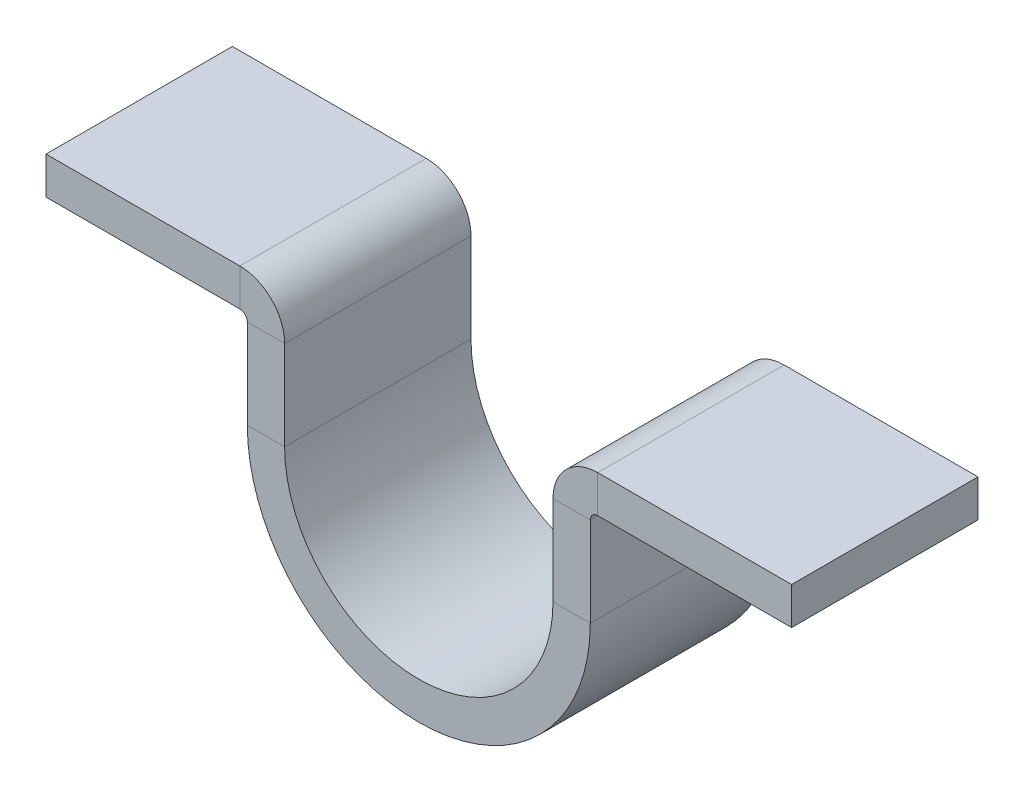
ISO-10303-21;
HEADER;
FILE_DESCRIPTION(('STEP AP214'),'2;1');
FILE_NAME('part.step','',(''),(''),'','','');
FILE_SCHEMA(('AUTOMOTIVE_DESIGN { 1 0 10303 214 1 1 1 1 }'));
ENDSEC;
DATA;
#1=APPLICATION_CONTEXT('core data for automotive mechanical design processes');
#2=APPLICATION_PROTOCOL_DEFINITION('international standard','automotive_design',2000,#1);
#3=PRODUCT_CONTEXT('',#1,'mechanical');
#4=PRODUCT('Part','Part','',(#3));
#5=PRODUCT_RELATED_PRODUCT_CATEGORY('part','',(#4));
#6=PRODUCT_DEFINITION_FORMATION('','',#4);
#7=PRODUCT_DEFINITION_CONTEXT('part definition',#1,'design');
#8=PRODUCT_DEFINITION('design','',#6,#7);
#9=PRODUCT_DEFINITION_SHAPE('','',#8);
#10=(LENGTH_UNIT() NAMED_UNIT(*) SI_UNIT(.MILLI.,.METRE.));
#11=(NAMED_UNIT(*) PLANE_ANGLE_UNIT() SI_UNIT($,.RADIAN.));
#12=(NAMED_UNIT(*) SI_UNIT($,.STERADIAN.) SOLID_ANGLE_UNIT());
#13=UNCERTAINTY_MEASURE_WITH_UNIT(LENGTH_MEASURE(1.E-05),#10,'distance_accuracy_value','');
#14=(GEOMETRIC_REPRESENTATION_CONTEXT(3) GLOBAL_UNCERTAINTY_ASSIGNED_CONTEXT((#13)) GLOBAL_UNIT_ASSIGNED_CONTEXT((#10,
#11,#12)) REPRESENTATION_CONTEXT('',''));
#15=CARTESIAN_POINT('',(0.,0.,0.));
#16=DIRECTION('',(0.,0.,1.));
#17=DIRECTION('',(1.,0.,0.));
#18=AXIS2_PLACEMENT_3D('',#15,#16,#17);
#19=CARTESIAN_POINT('',(18.,-18.,25.));
#20=DIRECTION('',(0.,0.,1.));
#21=DIRECTION('',(1.,0.,0.));
#22=AXIS2_PLACEMENT_3D('',#19,#20,#21);
#23=PLANE('',#22);
#24=DIRECTION('',(1.,0.,0.));
#25=VECTOR('',#24,1.);
#26=CARTESIAN_POINT('',(18.,-18.,25.));
#27=LINE('',#26,#25);
#28=CARTESIAN_POINT('',(18.,-18.,25.));
#29=VERTEX_POINT('',#28);
#30=CARTESIAN_POINT('',(23.,-18.,25.));
#31=VERTEX_POINT('',#30);
#32=EDGE_CURVE('E11',#29,#31,#27,.T.);
#33=ORIENTED_EDGE('',*,*,#32,.F.);
#34=CARTESIAN_POINT('',(0.,-18.,25.));
#35=DIRECTION('',(0.,0.,1.));
#36=DIRECTION('',(1.,0.,0.));
#37=AXIS2_PLACEMENT_3D('',#34,#35,#36);
#38=CIRCLE('',#37,18.);
#39=CARTESIAN_POINT('',(-18.,-18.,25.));
#40=VERTEX_POINT('',#39);
#41=EDGE_CURVE('E304',#40,#29,#38,.T.);
#42=ORIENTED_EDGE('',*,*,#41,.F.);
#43=DIRECTION('',(1.,0.,0.));
#44=VECTOR('',#43,1.);
#45=CARTESIAN_POINT('',(-23.,-18.,25.));
#46=LINE('',#45,#44);
#47=CARTESIAN_POINT('',(-23.,-18.,25.));
#48=VERTEX_POINT('',#47);
#49=EDGE_CURVE('E47',#48,#40,#46,.T.);
#50=ORIENTED_EDGE('',*,*,#49,.F.);
#51=CARTESIAN_POINT('',(0.,-18.,25.));
#52=DIRECTION('',(0.,0.,1.));
#53=DIRECTION('',(1.,0.,0.));
#54=AXIS2_PLACEMENT_3D('',#51,#52,#53);
#55=CIRCLE('',#54,23.);
#56=EDGE_CURVE('E172',#48,#31,#55,.T.);
#57=ORIENTED_EDGE('',*,*,#56,.T.);
#58=EDGE_LOOP('',(#33,#42,#50,#57));
#59=FACE_BOUND('',#58,.T.);
#60=ADVANCED_FACE('F39',(#59),#23,.T.);
#61=CARTESIAN_POINT('',(-23.,-18.,25.));
#62=DIRECTION('',(0.,0.,1.));
#63=DIRECTION('',(1.,0.,0.));
#64=AXIS2_PLACEMENT_3D('',#61,#62,#63);
#65=PLANE('',#64);
#66=DIRECTION('',(0.,1.,0.));
#67=VECTOR('',#66,1.);
#68=CARTESIAN_POINT('',(18.,-18.,25.));
#69=LINE('',#68,#67);
#70=CARTESIAN_POINT('',(18.,-6.,25.));
#71=VERTEX_POINT('',#70);
#72=EDGE_CURVE('E166',#29,#71,#69,.T.);
#73=ORIENTED_EDGE('',*,*,#72,.F.);
#74=ORIENTED_EDGE('',*,*,#32,.T.);
#75=DIRECTION('',(0.,1.,0.));
#76=VECTOR('',#75,1.);
#77=CARTESIAN_POINT('',(23.,-18.,25.));
#78=LINE('',#77,#76);
#79=CARTESIAN_POINT('',(23.,-6.,25.));
#80=VERTEX_POINT('',#79);
#81=EDGE_CURVE('E163',#31,#80,#78,.T.);
#82=ORIENTED_EDGE('',*,*,#81,.T.);
#83=DIRECTION('',(-1.,0.,0.));
#84=VECTOR('',#83,1.);
#85=CARTESIAN_POINT('',(23.,-6.,25.));
#86=LINE('',#85,#84);
#87=EDGE_CURVE('E278',#80,#71,#86,.T.);
#88=ORIENTED_EDGE('',*,*,#87,.T.);
#89=EDGE_LOOP('',(#73,#74,#82,#88));
#90=FACE_BOUND('',#89,.T.);
#91=ADVANCED_FACE('F161',(#90),#65,.T.);
#92=CARTESIAN_POINT('',(-18.,-18.,0.));
#93=DIRECTION('',(0.,0.,-1.));
#94=DIRECTION('',(-1.,0.,0.));
#95=AXIS2_PLACEMENT_3D('',#92,#93,#94);
#96=PLANE('',#95);
#97=DIRECTION('',(-1.,0.,0.));
#98=VECTOR('',#97,1.);
#99=CARTESIAN_POINT('',(-18.,-18.,0.));
#100=LINE('',#99,#98);
#101=CARTESIAN_POINT('',(-18.,-18.,0.));
#102=VERTEX_POINT('',#101);
#103=CARTESIAN_POINT('',(-23.,-18.,0.));
#104=VERTEX_POINT('',#103);
#105=EDGE_CURVE('E291',#102,#104,#100,.T.);
#106=ORIENTED_EDGE('',*,*,#105,.F.);
#107=CARTESIAN_POINT('',(0.,-18.,0.));
#108=DIRECTION('',(0.,0.,1.));
#109=DIRECTION('',(1.,0.,0.));
#110=AXIS2_PLACEMENT_3D('',#107,#108,#109);
#111=CIRCLE('',#110,18.);
#112=CARTESIAN_POINT('',(18.,-18.,0.));
#113=VERTEX_POINT('',#112);
#114=EDGE_CURVE('E211',#102,#113,#111,.T.);
#115=ORIENTED_EDGE('',*,*,#114,.T.);
#116=DIRECTION('',(-1.,0.,0.));
#117=VECTOR('',#116,1.);
#118=CARTESIAN_POINT('',(23.,-18.,0.));
#119=LINE('',#118,#117);
#120=CARTESIAN_POINT('',(23.,-18.,0.));
#121=VERTEX_POINT('',#120);
#122=EDGE_CURVE('E289',#121,#113,#119,.T.);
#123=ORIENTED_EDGE('',*,*,#122,.F.);
#124=CARTESIAN_POINT('',(0.,-18.,0.));
#125=DIRECTION('',(0.,0.,1.));
#126=DIRECTION('',(1.,0.,0.));
#127=AXIS2_PLACEMENT_3D('',#124,#125,#126);
#128=CIRCLE('',#127,23.);
#129=EDGE_CURVE('E184',#104,#121,#128,.T.);
#130=ORIENTED_EDGE('',*,*,#129,.F.);
#131=EDGE_LOOP('',(#106,#115,#123,#130));
#132=FACE_BOUND('',#131,.T.);
#133=ADVANCED_FACE('F338',(#132),#96,.T.);
#134=CARTESIAN_POINT('',(23.,-18.,0.));
#135=DIRECTION('',(0.,0.,-1.));
#136=DIRECTION('',(-1.,0.,0.));
#137=AXIS2_PLACEMENT_3D('',#134,#135,#136);
#138=PLANE('',#137);
#139=DIRECTION('',(0.,-1.,0.));
#140=VECTOR('',#139,1.);
#141=CARTESIAN_POINT('',(-18.,0.,0.));
#142=LINE('',#141,#140);
#143=CARTESIAN_POINT('',(-18.,-6.,0.));
#144=VERTEX_POINT('',#143);
#145=EDGE_CURVE('E214',#144,#102,#142,.T.);
#146=ORIENTED_EDGE('',*,*,#145,.T.);
#147=ORIENTED_EDGE('',*,*,#105,.T.);
#148=DIRECTION('',(0.,-1.,0.));
#149=VECTOR('',#148,1.);
#150=CARTESIAN_POINT('',(-23.,0.,0.));
#151=LINE('',#150,#149);
#152=CARTESIAN_POINT('',(-23.,-6.,0.));
#153=VERTEX_POINT('',#152);
#154=EDGE_CURVE('E232',#153,#104,#151,.T.);
#155=ORIENTED_EDGE('',*,*,#154,.F.);
#156=DIRECTION('',(1.,0.,0.));
#157=VECTOR('',#156,1.);
#158=CARTESIAN_POINT('',(-23.,-6.,0.));
#159=LINE('',#158,#157);
#160=EDGE_CURVE('E281',#153,#144,#159,.T.);
#161=ORIENTED_EDGE('',*,*,#160,.T.);
#162=EDGE_LOOP('',(#146,#147,#155,#161));
#163=FACE_BOUND('',#162,.T.);
#164=ADVANCED_FACE('F393',(#163),#138,.T.);
#165=CARTESIAN_POINT('',(-18.,-6.,25.));
#166=DIRECTION('',(0.,0.,1.));
#167=DIRECTION('',(1.,0.,0.));
#168=AXIS2_PLACEMENT_3D('',#165,#166,#167);
#169=PLANE('',#168);
#170=DIRECTION('',(-1.,0.,0.));
#171=VECTOR('',#170,1.);
#172=CARTESIAN_POINT('',(-18.,-6.,25.));
#173=LINE('',#172,#171);
#174=CARTESIAN_POINT('',(-18.,-6.,25.));
#175=VERTEX_POINT('',#174);
#176=CARTESIAN_POINT('',(-23.,-6.,25.));
#177=VERTEX_POINT('',#176);
#178=EDGE_CURVE('E287',#175,#177,#173,.T.);
#179=ORIENTED_EDGE('',*,*,#178,.F.);
#180=CARTESIAN_POINT('',(-24.,-6.,25.));
#181=DIRECTION('',(0.,0.,1.));
#182=DIRECTION('',(1.,0.,0.));
#183=AXIS2_PLACEMENT_3D('',#180,#181,#182);
#184=CIRCLE('',#183,6.);
#185=CARTESIAN_POINT('',(-24.,0.,25.));
#186=VERTEX_POINT('',#185);
#187=EDGE_CURVE('E310',#186,#175,#184,.F.);
#188=ORIENTED_EDGE('',*,*,#187,.F.);
#189=DIRECTION('',(0.,1.,0.));
#190=VECTOR('',#189,1.);
#191=CARTESIAN_POINT('',(-24.,-5.,25.));
#192=LINE('',#191,#190);
#193=CARTESIAN_POINT('',(-24.,-5.,25.));
#194=VERTEX_POINT('',#193);
#195=EDGE_CURVE('E285',#194,#186,#192,.T.);
#196=ORIENTED_EDGE('',*,*,#195,.F.);
#197=CARTESIAN_POINT('',(-24.,-6.,25.));
#198=DIRECTION('',(0.,0.,1.));
#199=DIRECTION('',(1.,0.,0.));
#200=AXIS2_PLACEMENT_3D('',#197,#198,#199);
#201=CIRCLE('',#200,1.);
#202=EDGE_CURVE('E324',#194,#177,#201,.F.);
#203=ORIENTED_EDGE('',*,*,#202,.T.);
#204=EDGE_LOOP('',(#179,#188,#196,#203));
#205=FACE_BOUND('',#204,.T.);
#206=ADVANCED_FACE('F329',(#205),#169,.T.);
#207=CARTESIAN_POINT('',(-24.,-5.,25.));
#208=DIRECTION('',(0.,0.,1.));
#209=DIRECTION('',(1.,0.,0.));
#210=AXIS2_PLACEMENT_3D('',#207,#208,#209);
#211=PLANE('',#210);
#212=DIRECTION('',(0.,-1.,0.));
#213=VECTOR('',#212,1.);
#214=CARTESIAN_POINT('',(-18.,0.,25.));
#215=LINE('',#214,#213);
#216=EDGE_CURVE('E297',#175,#40,#215,.T.);
#217=ORIENTED_EDGE('',*,*,#216,.F.);
#218=ORIENTED_EDGE('',*,*,#178,.T.);
#219=DIRECTION('',(0.,-1.,0.));
#220=VECTOR('',#219,1.);
#221=CARTESIAN_POINT('',(-23.,0.,25.));
#222=LINE('',#221,#220);
#223=EDGE_CURVE('E177',#177,#48,#222,.T.);
#224=ORIENTED_EDGE('',*,*,#223,.T.);
#225=ORIENTED_EDGE('',*,*,#49,.T.);
#226=EDGE_LOOP('',(#217,#218,#224,#225));
#227=FACE_BOUND('',#226,.T.);
#228=ADVANCED_FACE('F295',(#227),#211,.T.);
#229=CARTESIAN_POINT('',(-24.,0.,0.));
#230=DIRECTION('',(0.,0.,-1.));
#231=DIRECTION('',(-1.,0.,0.));
#232=AXIS2_PLACEMENT_3D('',#229,#230,#231);
#233=PLANE('',#232);
#234=DIRECTION('',(0.,-1.,0.));
#235=VECTOR('',#234,1.);
#236=CARTESIAN_POINT('',(-24.,0.,0.));
#237=LINE('',#236,#235);
#238=CARTESIAN_POINT('',(-24.,0.,0.));
#239=VERTEX_POINT('',#238);
#240=CARTESIAN_POINT('',(-24.,-5.,0.));
#241=VERTEX_POINT('',#240);
#242=EDGE_CURVE('E283',#239,#241,#237,.T.);
#243=ORIENTED_EDGE('',*,*,#242,.F.);
#244=CARTESIAN_POINT('',(-24.,-6.,0.));
#245=DIRECTION('',(0.,0.,1.));
#246=DIRECTION('',(1.,0.,0.));
#247=AXIS2_PLACEMENT_3D('',#244,#245,#246);
#248=CIRCLE('',#247,6.);
#249=EDGE_CURVE('E217',#239,#144,#248,.F.);
#250=ORIENTED_EDGE('',*,*,#249,.T.);
#251=ORIENTED_EDGE('',*,*,#160,.F.);
#252=CARTESIAN_POINT('',(-24.,-6.,0.));
#253=DIRECTION('',(0.,0.,1.));
#254=DIRECTION('',(1.,0.,0.));
#255=AXIS2_PLACEMENT_3D('',#252,#253,#254);
#256=CIRCLE('',#255,1.);
#257=EDGE_CURVE('E229',#241,#153,#256,.F.);
#258=ORIENTED_EDGE('',*,*,#257,.F.);
#259=EDGE_LOOP('',(#243,#250,#251,#258));
#260=FACE_BOUND('',#259,.T.);
#261=ADVANCED_FACE('F403',(#260),#233,.T.);
#262=CARTESIAN_POINT('',(-23.,-6.,0.));
#263=DIRECTION('',(0.,0.,-1.));
#264=DIRECTION('',(-1.,0.,0.));
#265=AXIS2_PLACEMENT_3D('',#262,#263,#264);
#266=PLANE('',#265);
#267=DIRECTION('',(1.,0.,0.));
#268=VECTOR('',#267,1.);
#269=CARTESIAN_POINT('',(-50.,0.,0.));
#270=LINE('',#269,#268);
#271=CARTESIAN_POINT('',(-50.,0.,0.));
#272=VERTEX_POINT('',#271);
#273=EDGE_CURVE('E220',#272,#239,#270,.T.);
#274=ORIENTED_EDGE('',*,*,#273,.T.);
#275=ORIENTED_EDGE('',*,*,#242,.T.);
#276=DIRECTION('',(1.,0.,0.));
#277=VECTOR('',#276,1.);
#278=CARTESIAN_POINT('',(-50.,-5.,0.));
#279=LINE('',#278,#277);
#280=CARTESIAN_POINT('',(-50.,-5.,0.));
#281=VERTEX_POINT('',#280);
#282=EDGE_CURVE('E226',#281,#241,#279,.T.);
#283=ORIENTED_EDGE('',*,*,#282,.F.);
#284=DIRECTION('',(0.,1.,0.));
#285=VECTOR('',#284,1.);
#286=CARTESIAN_POINT('',(-50.,-5.,0.));
#287=LINE('',#286,#285);
#288=EDGE_CURVE('E223',#281,#272,#287,.T.);
#289=ORIENTED_EDGE('',*,*,#288,.T.);
#290=EDGE_LOOP('',(#274,#275,#283,#289));
#291=FACE_BOUND('',#290,.T.);
#292=ADVANCED_FACE('F384',(#291),#266,.T.);
#293=CARTESIAN_POINT('',(24.,0.,25.));
#294=DIRECTION('',(0.,0.,1.));
#295=DIRECTION('',(1.,0.,0.));
#296=AXIS2_PLACEMENT_3D('',#293,#294,#295);
#297=PLANE('',#296);
#298=DIRECTION('',(0.,-1.,0.));
#299=VECTOR('',#298,1.);
#300=CARTESIAN_POINT('',(24.,0.,25.));
#301=LINE('',#300,#299);
#302=CARTESIAN_POINT('',(24.,0.,25.));
#303=VERTEX_POINT('',#302);
#304=CARTESIAN_POINT('',(24.,-5.,25.));
#305=VERTEX_POINT('',#304);
#306=EDGE_CURVE('E55',#303,#305,#301,.T.);
#307=ORIENTED_EDGE('',*,*,#306,.F.);
#308=CARTESIAN_POINT('',(24.,-6.,25.));
#309=DIRECTION('',(0.,0.,1.));
#310=DIRECTION('',(1.,0.,0.));
#311=AXIS2_PLACEMENT_3D('',#308,#309,#310);
#312=CIRCLE('',#311,6.);
#313=EDGE_CURVE('E368',#71,#303,#312,.F.);
#314=ORIENTED_EDGE('',*,*,#313,.F.);
#315=ORIENTED_EDGE('',*,*,#87,.F.);
#316=CARTESIAN_POINT('',(24.,-6.,25.));
#317=DIRECTION('',(0.,0.,1.));
#318=DIRECTION('',(1.,0.,0.));
#319=AXIS2_PLACEMENT_3D('',#316,#317,#318);
#320=CIRCLE('',#319,1.);
#321=EDGE_CURVE('E192',#80,#305,#320,.F.);
#322=ORIENTED_EDGE('',*,*,#321,.T.);
#323=EDGE_LOOP('',(#307,#314,#315,#322));
#324=FACE_BOUND('',#323,.T.);
#325=ADVANCED_FACE('F373',(#324),#297,.T.);
#326=CARTESIAN_POINT('',(23.,-6.,25.));
#327=DIRECTION('',(0.,0.,1.));
#328=DIRECTION('',(1.,0.,0.));
#329=AXIS2_PLACEMENT_3D('',#326,#327,#328);
#330=PLANE('',#329);
#331=DIRECTION('',(1.,0.,0.));
#332=VECTOR('',#331,1.);
#333=CARTESIAN_POINT('',(18.,0.,25.));
#334=LINE('',#333,#332);
#335=CARTESIAN_POINT('',(50.,0.,25.));
#336=VERTEX_POINT('',#335);
#337=EDGE_CURVE('E366',#303,#336,#334,.T.);
#338=ORIENTED_EDGE('',*,*,#337,.F.);
#339=ORIENTED_EDGE('',*,*,#306,.T.);
#340=DIRECTION('',(1.,0.,0.));
#341=VECTOR('',#340,1.);
#342=CARTESIAN_POINT('',(18.,-5.,25.));
#343=LINE('',#342,#341);
#344=CARTESIAN_POINT('',(50.,-5.,25.));
#345=VERTEX_POINT('',#344);
#346=EDGE_CURVE('E121',#305,#345,#343,.T.);
#347=ORIENTED_EDGE('',*,*,#346,.T.);
#348=DIRECTION('',(0.,-1.,0.));
#349=VECTOR('',#348,1.);
#350=CARTESIAN_POINT('',(50.,0.,25.));
#351=LINE('',#350,#349);
#352=EDGE_CURVE('E364',#336,#345,#351,.T.);
#353=ORIENTED_EDGE('',*,*,#352,.F.);
#354=EDGE_LOOP('',(#338,#339,#347,#353));
#355=FACE_BOUND('',#354,.T.);
#356=ADVANCED_FACE('F376',(#355),#330,.T.);
#357=CARTESIAN_POINT('',(18.,-6.,0.));
#358=DIRECTION('',(0.,0.,-1.));
#359=DIRECTION('',(-1.,0.,0.));
#360=AXIS2_PLACEMENT_3D('',#357,#358,#359);
#361=PLANE('',#360);
#362=DIRECTION('',(1.,0.,0.));
#363=VECTOR('',#362,1.);
#364=CARTESIAN_POINT('',(18.,-6.,0.));
#365=LINE('',#364,#363);
#366=CARTESIAN_POINT('',(18.,-6.,0.));
#367=VERTEX_POINT('',#366);
#368=CARTESIAN_POINT('',(23.,-6.,0.));
#369=VERTEX_POINT('',#368);
#370=EDGE_CURVE('E108',#367,#369,#365,.T.);
#371=ORIENTED_EDGE('',*,*,#370,.F.);
#372=CARTESIAN_POINT('',(24.,-6.,0.));
#373=DIRECTION('',(0.,0.,1.));
#374=DIRECTION('',(1.,0.,0.));
#375=AXIS2_PLACEMENT_3D('',#372,#373,#374);
#376=CIRCLE('',#375,6.);
#377=CARTESIAN_POINT('',(24.,0.,0.));
#378=VERTEX_POINT('',#377);
#379=EDGE_CURVE('E207',#367,#378,#376,.F.);
#380=ORIENTED_EDGE('',*,*,#379,.T.);
#381=DIRECTION('',(0.,1.,0.));
#382=VECTOR('',#381,1.);
#383=CARTESIAN_POINT('',(24.,-5.,0.));
#384=LINE('',#383,#382);
#385=CARTESIAN_POINT('',(24.,-5.,0.));
#386=VERTEX_POINT('',#385);
#387=EDGE_CURVE('E115',#386,#378,#384,.T.);
#388=ORIENTED_EDGE('',*,*,#387,.F.);
#389=CARTESIAN_POINT('',(24.,-6.,0.));
#390=DIRECTION('',(0.,0.,1.));
#391=DIRECTION('',(1.,0.,0.));
#392=AXIS2_PLACEMENT_3D('',#389,#390,#391);
#393=CIRCLE('',#392,1.);
#394=EDGE_CURVE('E238',#369,#386,#393,.F.);
#395=ORIENTED_EDGE('',*,*,#394,.F.);
#396=EDGE_LOOP('',(#371,#380,#388,#395));
#397=FACE_BOUND('',#396,.T.);
#398=ADVANCED_FACE('F351',(#397),#361,.T.);
#399=CARTESIAN_POINT('',(24.,-5.,0.));
#400=DIRECTION('',(0.,0.,-1.));
#401=DIRECTION('',(-1.,0.,0.));
#402=AXIS2_PLACEMENT_3D('',#399,#400,#401);
#403=PLANE('',#402);
#404=DIRECTION('',(0.,1.,0.));
#405=VECTOR('',#404,1.);
#406=CARTESIAN_POINT('',(18.,-18.,0.));
#407=LINE('',#406,#405);
#408=EDGE_CURVE('E209',#113,#367,#407,.T.);
#409=ORIENTED_EDGE('',*,*,#408,.T.);
#410=ORIENTED_EDGE('',*,*,#370,.T.);
#411=DIRECTION('',(0.,1.,0.));
#412=VECTOR('',#411,1.);
#413=CARTESIAN_POINT('',(23.,-18.,0.));
#414=LINE('',#413,#412);
#415=EDGE_CURVE('E236',#121,#369,#414,.T.);
#416=ORIENTED_EDGE('',*,*,#415,.F.);
#417=ORIENTED_EDGE('',*,*,#122,.T.);
#418=EDGE_LOOP('',(#409,#410,#416,#417));
#419=FACE_BOUND('',#418,.T.);
#420=ADVANCED_FACE('F339',(#419),#403,.T.);
#421=CARTESIAN_POINT('',(18.,-5.,25.));
#422=DIRECTION('',(0.,1.,0.));
#423=DIRECTION('',(0.,0.,1.));
#424=AXIS2_PLACEMENT_3D('',#421,#422,#423);
#425=PLANE('',#424);
#426=DIRECTION('',(1.,0.,0.));
#427=VECTOR('',#426,1.);
#428=CARTESIAN_POINT('',(18.,-5.,0.));
#429=LINE('',#428,#427);
#430=CARTESIAN_POINT('',(50.,-5.,0.));
#431=VERTEX_POINT('',#430);
#432=EDGE_CURVE('E198',#386,#431,#429,.T.);
#433=ORIENTED_EDGE('',*,*,#432,.T.);
#434=DIRECTION('',(0.,0.,-1.));
#435=VECTOR('',#434,1.);
#436=CARTESIAN_POINT('',(50.,-5.,25.));
#437=LINE('',#436,#435);
#438=EDGE_CURVE('E274',#345,#431,#437,.T.);
#439=ORIENTED_EDGE('',*,*,#438,.F.);
#440=ORIENTED_EDGE('',*,*,#346,.F.);
#441=DIRECTION('',(0.,0.,-1.));
#442=VECTOR('',#441,1.);
#443=CARTESIAN_POINT('',(24.,-5.,25.));
#444=LINE('',#443,#442);
#445=EDGE_CURVE('E194',#305,#386,#444,.T.);
#446=ORIENTED_EDGE('',*,*,#445,.T.);
#447=EDGE_LOOP('',(#433,#439,#440,#446));
#448=FACE_BOUND('',#447,.T.);
#449=ADVANCED_FACE('F357',(#448),#425,.F.);
#450=CARTESIAN_POINT('',(50.,0.,25.));
#451=DIRECTION('',(1.,0.,0.));
#452=DIRECTION('',(0.,0.,-1.));
#453=AXIS2_PLACEMENT_3D('',#450,#451,#452);
#454=PLANE('',#453);
#455=DIRECTION('',(0.,-1.,0.));
#456=VECTOR('',#455,1.);
#457=CARTESIAN_POINT('',(50.,0.,0.));
#458=LINE('',#457,#456);
#459=CARTESIAN_POINT('',(50.,0.,0.));
#460=VERTEX_POINT('',#459);
#461=EDGE_CURVE('E201',#460,#431,#458,.T.);
#462=ORIENTED_EDGE('',*,*,#461,.F.);
#463=DIRECTION('',(0.,0.,-1.));
#464=VECTOR('',#463,1.);
#465=CARTESIAN_POINT('',(50.,0.,25.));
#466=LINE('',#465,#464);
#467=EDGE_CURVE('E272',#336,#460,#466,.T.);
#468=ORIENTED_EDGE('',*,*,#467,.F.);
#469=ORIENTED_EDGE('',*,*,#352,.T.);
#470=ORIENTED_EDGE('',*,*,#438,.T.);
#471=EDGE_LOOP('',(#462,#468,#469,#470));
#472=FACE_BOUND('',#471,.T.);
#473=ADVANCED_FACE('F362',(#472),#454,.T.);
#474=CARTESIAN_POINT('',(18.,0.,25.));
#475=DIRECTION('',(0.,1.,0.));
#476=DIRECTION('',(0.,0.,1.));
#477=AXIS2_PLACEMENT_3D('',#474,#475,#476);
#478=PLANE('',#477);
#479=DIRECTION('',(1.,0.,0.));
#480=VECTOR('',#479,1.);
#481=CARTESIAN_POINT('',(18.,0.,0.));
#482=LINE('',#481,#480);
#483=EDGE_CURVE('E204',#378,#460,#482,.T.);
#484=ORIENTED_EDGE('',*,*,#483,.F.);
#485=DIRECTION('',(0.,0.,-1.));
#486=VECTOR('',#485,1.);
#487=CARTESIAN_POINT('',(24.,0.,25.));
#488=LINE('',#487,#486);
#489=EDGE_CURVE('E269',#303,#378,#488,.T.);
#490=ORIENTED_EDGE('',*,*,#489,.F.);
#491=ORIENTED_EDGE('',*,*,#337,.T.);
#492=ORIENTED_EDGE('',*,*,#467,.T.);
#493=EDGE_LOOP('',(#484,#490,#491,#492));
#494=FACE_BOUND('',#493,.T.);
#495=ADVANCED_FACE('F375',(#494),#478,.T.);
#496=CARTESIAN_POINT('',(24.,-6.,25.));
#497=DIRECTION('',(0.,0.,-1.));
#498=DIRECTION('',(-1.,0.,0.));
#499=AXIS2_PLACEMENT_3D('',#496,#497,#498);
#500=CYLINDRICAL_SURFACE('',#499,6.);
#501=ORIENTED_EDGE('',*,*,#379,.F.);
#502=DIRECTION('',(0.,0.,-1.));
#503=VECTOR('',#502,1.);
#504=CARTESIAN_POINT('',(18.,-6.,25.));
#505=LINE('',#504,#503);
#506=EDGE_CURVE('E266',#71,#367,#505,.T.);
#507=ORIENTED_EDGE('',*,*,#506,.F.);
#508=ORIENTED_EDGE('',*,*,#313,.T.);
#509=ORIENTED_EDGE('',*,*,#489,.T.);
#510=EDGE_LOOP('',(#501,#507,#508,#509));
#511=FACE_BOUND('',#510,.T.);
#512=ADVANCED_FACE('F348',(#511),#500,.T.);
#513=CARTESIAN_POINT('',(18.,-18.,25.));
#514=DIRECTION('',(-1.,0.,0.));
#515=DIRECTION('',(0.,-1.,0.));
#516=AXIS2_PLACEMENT_3D('',#513,#514,#515);
#517=PLANE('',#516);
#518=ORIENTED_EDGE('',*,*,#408,.F.);
#519=DIRECTION('',(0.,0.,-1.));
#520=VECTOR('',#519,1.);
#521=CARTESIAN_POINT('',(18.,-18.,25.));
#522=LINE('',#521,#520);
#523=EDGE_CURVE('E263',#29,#113,#522,.T.);
#524=ORIENTED_EDGE('',*,*,#523,.F.);
#525=ORIENTED_EDGE('',*,*,#72,.T.);
#526=ORIENTED_EDGE('',*,*,#506,.T.);
#527=EDGE_LOOP('',(#518,#524,#525,#526));
#528=FACE_BOUND('',#527,.T.);
#529=ADVANCED_FACE('F342',(#528),#517,.T.);
#530=CARTESIAN_POINT('',(0.,-18.,25.));
#531=DIRECTION('',(0.,0.,-1.));
#532=DIRECTION('',(-1.,0.,0.));
#533=AXIS2_PLACEMENT_3D('',#530,#531,#532);
#534=CYLINDRICAL_SURFACE('',#533,18.);
#535=ORIENTED_EDGE('',*,*,#114,.F.);
#536=DIRECTION('',(0.,0.,-1.));
#537=VECTOR('',#536,1.);
#538=CARTESIAN_POINT('',(-18.,-18.,25.));
#539=LINE('',#538,#537);
#540=EDGE_CURVE('E260',#40,#102,#539,.T.);
#541=ORIENTED_EDGE('',*,*,#540,.F.);
#542=ORIENTED_EDGE('',*,*,#41,.T.);
#543=ORIENTED_EDGE('',*,*,#523,.T.);
#544=EDGE_LOOP('',(#535,#541,#542,#543));
#545=FACE_BOUND('',#544,.T.);
#546=ADVANCED_FACE('F303',(#545),#534,.F.);
#547=CARTESIAN_POINT('',(-18.,0.,25.));
#548=DIRECTION('',(1.,0.,0.));
#549=DIRECTION('',(0.,1.,0.));
#550=AXIS2_PLACEMENT_3D('',#547,#548,#549);
#551=PLANE('',#550);
#552=ORIENTED_EDGE('',*,*,#145,.F.);
#553=DIRECTION('',(0.,0.,-1.));
#554=VECTOR('',#553,1.);
#555=CARTESIAN_POINT('',(-18.,-6.,25.));
#556=LINE('',#555,#554);
#557=EDGE_CURVE('E257',#175,#144,#556,.T.);
#558=ORIENTED_EDGE('',*,*,#557,.F.);
#559=ORIENTED_EDGE('',*,*,#216,.T.);
#560=ORIENTED_EDGE('',*,*,#540,.T.);
#561=EDGE_LOOP('',(#552,#558,#559,#560));
#562=FACE_BOUND('',#561,.T.);
#563=ADVANCED_FACE('F309',(#562),#551,.T.);
#564=CARTESIAN_POINT('',(-24.,-6.,25.));
#565=DIRECTION('',(0.,0.,-1.));
#566=DIRECTION('',(-1.,0.,0.));
#567=AXIS2_PLACEMENT_3D('',#564,#565,#566);
#568=CYLINDRICAL_SURFACE('',#567,6.);
#569=ORIENTED_EDGE('',*,*,#249,.F.);
#570=DIRECTION('',(0.,0.,-1.));
#571=VECTOR('',#570,1.);
#572=CARTESIAN_POINT('',(-24.,0.,25.));
#573=LINE('',#572,#571);
#574=EDGE_CURVE('E254',#186,#239,#573,.T.);
#575=ORIENTED_EDGE('',*,*,#574,.F.);
#576=ORIENTED_EDGE('',*,*,#187,.T.);
#577=ORIENTED_EDGE('',*,*,#557,.T.);
#578=EDGE_LOOP('',(#569,#575,#576,#577));
#579=FACE_BOUND('',#578,.T.);
#580=ADVANCED_FACE('F420',(#579),#568,.T.);
#581=CARTESIAN_POINT('',(-50.,0.,25.));
#582=DIRECTION('',(0.,1.,0.));
#583=DIRECTION('',(0.,0.,1.));
#584=AXIS2_PLACEMENT_3D('',#581,#582,#583);
#585=PLANE('',#584);
#586=ORIENTED_EDGE('',*,*,#273,.F.);
#587=DIRECTION('',(0.,0.,-1.));
#588=VECTOR('',#587,1.);
#589=CARTESIAN_POINT('',(-50.,0.,25.));
#590=LINE('',#589,#588);
#591=CARTESIAN_POINT('',(-50.,0.,25.));
#592=VERTEX_POINT('',#591);
#593=EDGE_CURVE('E252',#592,#272,#590,.T.);
#594=ORIENTED_EDGE('',*,*,#593,.F.);
#595=DIRECTION('',(1.,0.,0.));
#596=VECTOR('',#595,1.);
#597=CARTESIAN_POINT('',(-50.,0.,25.));
#598=LINE('',#597,#596);
#599=EDGE_CURVE('E312',#592,#186,#598,.T.);
#600=ORIENTED_EDGE('',*,*,#599,.T.);
#601=ORIENTED_EDGE('',*,*,#574,.T.);
#602=EDGE_LOOP('',(#586,#594,#600,#601));
#603=FACE_BOUND('',#602,.T.);
#604=ADVANCED_FACE('F415',(#603),#585,.T.);
#605=CARTESIAN_POINT('',(-50.,-5.,25.));
#606=DIRECTION('',(-1.,0.,0.));
#607=DIRECTION('',(0.,0.,1.));
#608=AXIS2_PLACEMENT_3D('',#605,#606,#607);
#609=PLANE('',#608);
#610=ORIENTED_EDGE('',*,*,#288,.F.);
#611=DIRECTION('',(0.,0.,-1.));
#612=VECTOR('',#611,1.);
#613=CARTESIAN_POINT('',(-50.,-5.,25.));
#614=LINE('',#613,#612);
#615=CARTESIAN_POINT('',(-50.,-5.,25.));
#616=VERTEX_POINT('',#615);
#617=EDGE_CURVE('E250',#616,#281,#614,.T.);
#618=ORIENTED_EDGE('',*,*,#617,.F.);
#619=DIRECTION('',(0.,1.,0.));
#620=VECTOR('',#619,1.);
#621=CARTESIAN_POINT('',(-50.,-5.,25.));
#622=LINE('',#621,#620);
#623=EDGE_CURVE('E318',#616,#592,#622,.T.);
#624=ORIENTED_EDGE('',*,*,#623,.T.);
#625=ORIENTED_EDGE('',*,*,#593,.T.);
#626=EDGE_LOOP('',(#610,#618,#624,#625));
#627=FACE_BOUND('',#626,.T.);
#628=ADVANCED_FACE('F427',(#627),#609,.T.);
#629=CARTESIAN_POINT('',(-50.,-5.,25.));
#630=DIRECTION('',(0.,1.,0.));
#631=DIRECTION('',(0.,0.,1.));
#632=AXIS2_PLACEMENT_3D('',#629,#630,#631);
#633=PLANE('',#632);
#634=ORIENTED_EDGE('',*,*,#282,.T.);
#635=DIRECTION('',(0.,0.,-1.));
#636=VECTOR('',#635,1.);
#637=CARTESIAN_POINT('',(-24.,-5.,25.));
#638=LINE('',#637,#636);
#639=EDGE_CURVE('E247',#194,#241,#638,.T.);
#640=ORIENTED_EDGE('',*,*,#639,.F.);
#641=DIRECTION('',(1.,0.,0.));
#642=VECTOR('',#641,1.);
#643=CARTESIAN_POINT('',(-50.,-5.,25.));
#644=LINE('',#643,#642);
#645=EDGE_CURVE('E321',#616,#194,#644,.T.);
#646=ORIENTED_EDGE('',*,*,#645,.F.);
#647=ORIENTED_EDGE('',*,*,#617,.T.);
#648=EDGE_LOOP('',(#634,#640,#646,#647));
#649=FACE_BOUND('',#648,.T.);
#650=ADVANCED_FACE('F499',(#649),#633,.F.);
#651=CARTESIAN_POINT('',(-24.,-6.,25.));
#652=DIRECTION('',(0.,0.,-1.));
#653=DIRECTION('',(-1.,0.,0.));
#654=AXIS2_PLACEMENT_3D('',#651,#652,#653);
#655=CYLINDRICAL_SURFACE('',#654,1.);
#656=ORIENTED_EDGE('',*,*,#257,.T.);
#657=DIRECTION('',(0.,0.,-1.));
#658=VECTOR('',#657,1.);
#659=CARTESIAN_POINT('',(-23.,-6.,25.));
#660=LINE('',#659,#658);
#661=EDGE_CURVE('E244',#177,#153,#660,.T.);
#662=ORIENTED_EDGE('',*,*,#661,.F.);
#663=ORIENTED_EDGE('',*,*,#202,.F.);
#664=ORIENTED_EDGE('',*,*,#639,.T.);
#665=EDGE_LOOP('',(#656,#662,#663,#664));
#666=FACE_BOUND('',#665,.T.);
#667=ADVANCED_FACE('F332',(#666),#655,.F.);
#668=CARTESIAN_POINT('',(-23.,0.,25.));
#669=DIRECTION('',(1.,0.,0.));
#670=DIRECTION('',(0.,1.,0.));
#671=AXIS2_PLACEMENT_3D('',#668,#669,#670);
#672=PLANE('',#671);
#673=ORIENTED_EDGE('',*,*,#154,.T.);
#674=DIRECTION('',(0.,0.,-1.));
#675=VECTOR('',#674,1.);
#676=CARTESIAN_POINT('',(-23.,-18.,25.));
#677=LINE('',#676,#675);
#678=EDGE_CURVE('E186',#48,#104,#677,.T.);
#679=ORIENTED_EDGE('',*,*,#678,.F.);
#680=ORIENTED_EDGE('',*,*,#223,.F.);
#681=ORIENTED_EDGE('',*,*,#661,.T.);
#682=EDGE_LOOP('',(#673,#679,#680,#681));
#683=FACE_BOUND('',#682,.T.);
#684=ADVANCED_FACE('F336',(#683),#672,.F.);
#685=CARTESIAN_POINT('',(0.,-18.,25.));
#686=DIRECTION('',(0.,0.,-1.));
#687=DIRECTION('',(-1.,0.,0.));
#688=AXIS2_PLACEMENT_3D('',#685,#686,#687);
#689=CYLINDRICAL_SURFACE('',#688,23.);
#690=ORIENTED_EDGE('',*,*,#129,.T.);
#691=DIRECTION('',(0.,0.,-1.));
#692=VECTOR('',#691,1.);
#693=CARTESIAN_POINT('',(23.,-18.,25.));
#694=LINE('',#693,#692);
#695=EDGE_CURVE('E181',#31,#121,#694,.T.);
#696=ORIENTED_EDGE('',*,*,#695,.F.);
#697=ORIENTED_EDGE('',*,*,#56,.F.);
#698=ORIENTED_EDGE('',*,*,#678,.T.);
#699=EDGE_LOOP('',(#690,#696,#697,#698));
#700=FACE_BOUND('',#699,.T.);
#701=ADVANCED_FACE('F182',(#700),#689,.T.);
#702=CARTESIAN_POINT('',(23.,-18.,25.));
#703=DIRECTION('',(-1.,0.,0.));
#704=DIRECTION('',(0.,-1.,0.));
#705=AXIS2_PLACEMENT_3D('',#702,#703,#704);
#706=PLANE('',#705);
#707=ORIENTED_EDGE('',*,*,#415,.T.);
#708=DIRECTION('',(0.,0.,-1.));
#709=VECTOR('',#708,1.);
#710=CARTESIAN_POINT('',(23.,-6.,25.));
#711=LINE('',#710,#709);
#712=EDGE_CURVE('E187',#80,#369,#711,.T.);
#713=ORIENTED_EDGE('',*,*,#712,.F.);
#714=ORIENTED_EDGE('',*,*,#81,.F.);
#715=ORIENTED_EDGE('',*,*,#695,.T.);
#716=EDGE_LOOP('',(#707,#713,#714,#715));
#717=FACE_BOUND('',#716,.T.);
#718=ADVANCED_FACE('F189',(#717),#706,.F.);
#719=CARTESIAN_POINT('',(24.,-6.,25.));
#720=DIRECTION('',(0.,0.,-1.));
#721=DIRECTION('',(-1.,0.,0.));
#722=AXIS2_PLACEMENT_3D('',#719,#720,#721);
#723=CYLINDRICAL_SURFACE('',#722,1.);
#724=ORIENTED_EDGE('',*,*,#394,.T.);
#725=ORIENTED_EDGE('',*,*,#445,.F.);
#726=ORIENTED_EDGE('',*,*,#321,.F.);
#727=ORIENTED_EDGE('',*,*,#712,.T.);
#728=EDGE_LOOP('',(#724,#725,#726,#727));
#729=FACE_BOUND('',#728,.T.);
#730=ADVANCED_FACE('F354',(#729),#723,.F.);
#731=CARTESIAN_POINT('',(24.,-6.,25.));
#732=DIRECTION('',(0.,0.,1.));
#733=DIRECTION('',(1.,0.,0.));
#734=AXIS2_PLACEMENT_3D('',#731,#732,#733);
#735=PLANE('',#734);
#736=ORIENTED_EDGE('',*,*,#645,.T.);
#737=ORIENTED_EDGE('',*,*,#195,.T.);
#738=ORIENTED_EDGE('',*,*,#599,.F.);
#739=ORIENTED_EDGE('',*,*,#623,.F.);
#740=EDGE_LOOP('',(#736,#737,#738,#739));
#741=FACE_BOUND('',#740,.T.);
#742=ADVANCED_FACE('F555',(#741),#735,.T.);
#743=CARTESIAN_POINT('',(24.,-6.,0.));
#744=DIRECTION('',(0.,0.,1.));
#745=DIRECTION('',(1.,0.,0.));
#746=AXIS2_PLACEMENT_3D('',#743,#744,#745);
#747=PLANE('',#746);
#748=ORIENTED_EDGE('',*,*,#432,.F.);
#749=ORIENTED_EDGE('',*,*,#387,.T.);
#750=ORIENTED_EDGE('',*,*,#483,.T.);
#751=ORIENTED_EDGE('',*,*,#461,.T.);
#752=EDGE_LOOP('',(#748,#749,#750,#751));
#753=FACE_BOUND('',#752,.T.);
#754=ADVANCED_FACE('F359',(#753),#747,.F.);
#755=CLOSED_SHELL('',(#60,#91,#133,#164,#206,#228,#261,#292,#325,#356,#398,#420,#449,#473,#495,
#512,#529,#546,#563,#580,#604,#628,#650,#667,#684,#701,#718,#730,#742,#754));
#756=MANIFOLD_SOLID_BREP('B2',#755);
#757=ADVANCED_BREP_SHAPE_REPRESENTATION('',(#18,#756),#14);
#758=SHAPE_DEFINITION_REPRESENTATION(#9,#757);
ENDSEC;
END-ISO-10303-21;
